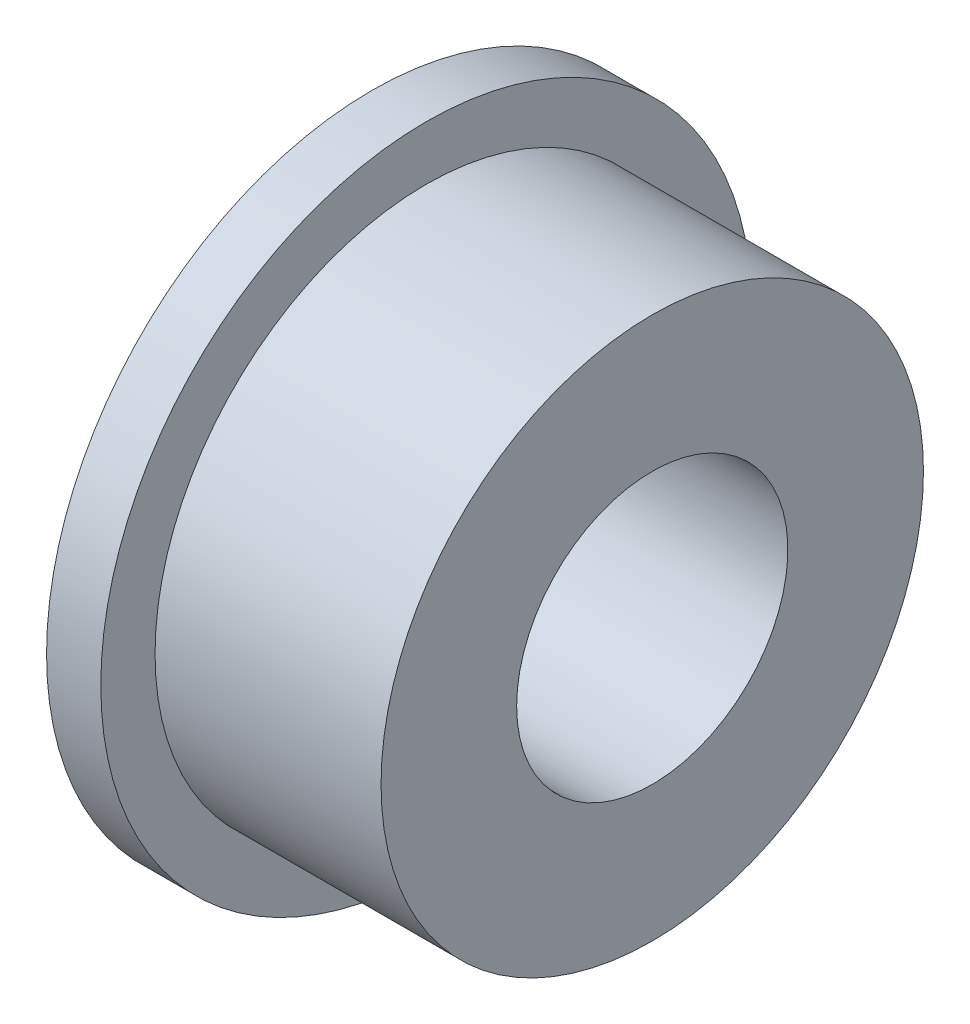
ISO-10303-21;
HEADER;
FILE_DESCRIPTION(('STEP AP214'),'2;1');
FILE_NAME('part.step','',(''),(''),'','','');
FILE_SCHEMA(('AUTOMOTIVE_DESIGN { 1 0 10303 214 1 1 1 1 }'));
ENDSEC;
DATA;
#1=APPLICATION_CONTEXT('core data for automotive mechanical design processes');
#2=APPLICATION_PROTOCOL_DEFINITION('international standard','automotive_design',2000,#1);
#3=PRODUCT_CONTEXT('',#1,'mechanical');
#4=PRODUCT('Part','Part','',(#3));
#5=PRODUCT_RELATED_PRODUCT_CATEGORY('part','',(#4));
#6=PRODUCT_DEFINITION_FORMATION('','',#4);
#7=PRODUCT_DEFINITION_CONTEXT('part definition',#1,'design');
#8=PRODUCT_DEFINITION('design','',#6,#7);
#9=PRODUCT_DEFINITION_SHAPE('','',#8);
#10=(LENGTH_UNIT() NAMED_UNIT(*) SI_UNIT(.MILLI.,.METRE.));
#11=(NAMED_UNIT(*) PLANE_ANGLE_UNIT() SI_UNIT($,.RADIAN.));
#12=(NAMED_UNIT(*) SI_UNIT($,.STERADIAN.) SOLID_ANGLE_UNIT());
#13=UNCERTAINTY_MEASURE_WITH_UNIT(LENGTH_MEASURE(1.E-05),#10,'distance_accuracy_value','');
#14=(GEOMETRIC_REPRESENTATION_CONTEXT(3) GLOBAL_UNCERTAINTY_ASSIGNED_CONTEXT((#13)) GLOBAL_UNIT_ASSIGNED_CONTEXT((#10,
#11,#12)) REPRESENTATION_CONTEXT('',''));
#15=CARTESIAN_POINT('',(0.,0.,0.));
#16=DIRECTION('',(0.,0.,1.));
#17=DIRECTION('',(1.,0.,0.));
#18=AXIS2_PLACEMENT_3D('',#15,#16,#17);
#19=CARTESIAN_POINT('',(0.,0.,0.));
#20=DIRECTION('',(-1.,0.,0.));
#21=DIRECTION('',(0.,0.,1.));
#22=AXIS2_PLACEMENT_3D('',#19,#20,#21);
#23=CYLINDRICAL_SURFACE('',#22,1.5);
#24=CARTESIAN_POINT('',(3.1,0.,0.));
#25=DIRECTION('',(-1.,0.,0.));
#26=DIRECTION('',(0.,0.,1.));
#27=AXIS2_PLACEMENT_3D('',#24,#25,#26);
#28=CIRCLE('',#27,1.5);
#29=CARTESIAN_POINT('',(3.1,0.,1.5));
#30=VERTEX_POINT('',#29);
#31=EDGE_CURVE('E55',#30,#30,#28,.T.);
#32=ORIENTED_EDGE('',*,*,#31,.F.);
#33=EDGE_LOOP('',(#32));
#34=FACE_BOUND('',#33,.T.);
#35=CARTESIAN_POINT('',(0.,0.,0.));
#36=DIRECTION('',(-1.,0.,0.));
#37=DIRECTION('',(0.,0.,1.));
#38=AXIS2_PLACEMENT_3D('',#35,#36,#37);
#39=CIRCLE('',#38,1.5);
#40=CARTESIAN_POINT('',(0.,0.,1.5));
#41=VERTEX_POINT('',#40);
#42=EDGE_CURVE('E10',#41,#41,#39,.T.);
#43=ORIENTED_EDGE('',*,*,#42,.T.);
#44=EDGE_LOOP('',(#43));
#45=FACE_BOUND('',#44,.T.);
#46=ADVANCED_FACE('F33',(#34,#45),#23,.F.);
#47=CARTESIAN_POINT('',(0.,1.5,0.));
#48=DIRECTION('',(1.,0.,0.));
#49=DIRECTION('',(0.,0.,-1.));
#50=AXIS2_PLACEMENT_3D('',#47,#48,#49);
#51=PLANE('',#50);
#52=ORIENTED_EDGE('',*,*,#42,.F.);
#53=EDGE_LOOP('',(#52));
#54=FACE_BOUND('',#53,.T.);
#55=CARTESIAN_POINT('',(0.,0.,0.));
#56=DIRECTION('',(-1.,0.,0.));
#57=DIRECTION('',(0.,0.,1.));
#58=AXIS2_PLACEMENT_3D('',#55,#56,#57);
#59=CIRCLE('',#58,3.6);
#60=CARTESIAN_POINT('',(0.,0.,3.6));
#61=VERTEX_POINT('',#60);
#62=EDGE_CURVE('E39',#61,#61,#59,.T.);
#63=ORIENTED_EDGE('',*,*,#62,.T.);
#64=EDGE_LOOP('',(#63));
#65=FACE_BOUND('',#64,.T.);
#66=ADVANCED_FACE('F62',(#54,#65),#51,.F.);
#67=CARTESIAN_POINT('',(0.,0.,0.));
#68=DIRECTION('',(-1.,0.,0.));
#69=DIRECTION('',(0.,0.,1.));
#70=AXIS2_PLACEMENT_3D('',#67,#68,#69);
#71=CYLINDRICAL_SURFACE('',#70,3.6);
#72=ORIENTED_EDGE('',*,*,#62,.F.);
#73=EDGE_LOOP('',(#72));
#74=FACE_BOUND('',#73,.T.);
#75=CARTESIAN_POINT('',(0.6,0.,0.));
#76=DIRECTION('',(-1.,0.,0.));
#77=DIRECTION('',(0.,0.,1.));
#78=AXIS2_PLACEMENT_3D('',#75,#76,#77);
#79=CIRCLE('',#78,3.6);
#80=CARTESIAN_POINT('',(0.6,0.,3.6));
#81=VERTEX_POINT('',#80);
#82=EDGE_CURVE('E43',#81,#81,#79,.T.);
#83=ORIENTED_EDGE('',*,*,#82,.T.);
#84=EDGE_LOOP('',(#83));
#85=FACE_BOUND('',#84,.T.);
#86=ADVANCED_FACE('F66',(#74,#85),#71,.T.);
#87=CARTESIAN_POINT('',(0.6,3.6,0.));
#88=DIRECTION('',(-1.,0.,0.));
#89=DIRECTION('',(0.,0.,1.));
#90=AXIS2_PLACEMENT_3D('',#87,#88,#89);
#91=PLANE('',#90);
#92=ORIENTED_EDGE('',*,*,#82,.F.);
#93=EDGE_LOOP('',(#92));
#94=FACE_BOUND('',#93,.T.);
#95=CARTESIAN_POINT('',(0.6,0.,0.));
#96=DIRECTION('',(-1.,0.,0.));
#97=DIRECTION('',(0.,0.,1.));
#98=AXIS2_PLACEMENT_3D('',#95,#96,#97);
#99=CIRCLE('',#98,3.);
#100=CARTESIAN_POINT('',(0.6,0.,3.));
#101=VERTEX_POINT('',#100);
#102=EDGE_CURVE('E47',#101,#101,#99,.T.);
#103=ORIENTED_EDGE('',*,*,#102,.T.);
#104=EDGE_LOOP('',(#103));
#105=FACE_BOUND('',#104,.T.);
#106=ADVANCED_FACE('F71',(#94,#105),#91,.F.);
#107=CARTESIAN_POINT('',(0.,0.,0.));
#108=DIRECTION('',(-1.,0.,0.));
#109=DIRECTION('',(0.,0.,1.));
#110=AXIS2_PLACEMENT_3D('',#107,#108,#109);
#111=CYLINDRICAL_SURFACE('',#110,3.);
#112=ORIENTED_EDGE('',*,*,#102,.F.);
#113=EDGE_LOOP('',(#112));
#114=FACE_BOUND('',#113,.T.);
#115=CARTESIAN_POINT('',(3.1,0.,0.));
#116=DIRECTION('',(-1.,0.,0.));
#117=DIRECTION('',(0.,0.,1.));
#118=AXIS2_PLACEMENT_3D('',#115,#116,#117);
#119=CIRCLE('',#118,3.);
#120=CARTESIAN_POINT('',(3.1,0.,3.));
#121=VERTEX_POINT('',#120);
#122=EDGE_CURVE('E52',#121,#121,#119,.T.);
#123=ORIENTED_EDGE('',*,*,#122,.T.);
#124=EDGE_LOOP('',(#123));
#125=FACE_BOUND('',#124,.T.);
#126=ADVANCED_FACE('F77',(#114,#125),#111,.T.);
#127=CARTESIAN_POINT('',(3.1,3.,0.));
#128=DIRECTION('',(-1.,0.,0.));
#129=DIRECTION('',(0.,0.,1.));
#130=AXIS2_PLACEMENT_3D('',#127,#128,#129);
#131=PLANE('',#130);
#132=ORIENTED_EDGE('',*,*,#122,.F.);
#133=EDGE_LOOP('',(#132));
#134=FACE_BOUND('',#133,.T.);
#135=ORIENTED_EDGE('',*,*,#31,.T.);
#136=EDGE_LOOP('',(#135));
#137=FACE_BOUND('',#136,.T.);
#138=ADVANCED_FACE('F59',(#134,#137),#131,.F.);
#139=CLOSED_SHELL('',(#46,#66,#86,#106,#126,#138));
#140=MANIFOLD_SOLID_BREP('B2',#139);
#141=ADVANCED_BREP_SHAPE_REPRESENTATION('',(#18,#140),#14);
#142=SHAPE_DEFINITION_REPRESENTATION(#9,#141);
ENDSEC;
END-ISO-10303-21;
